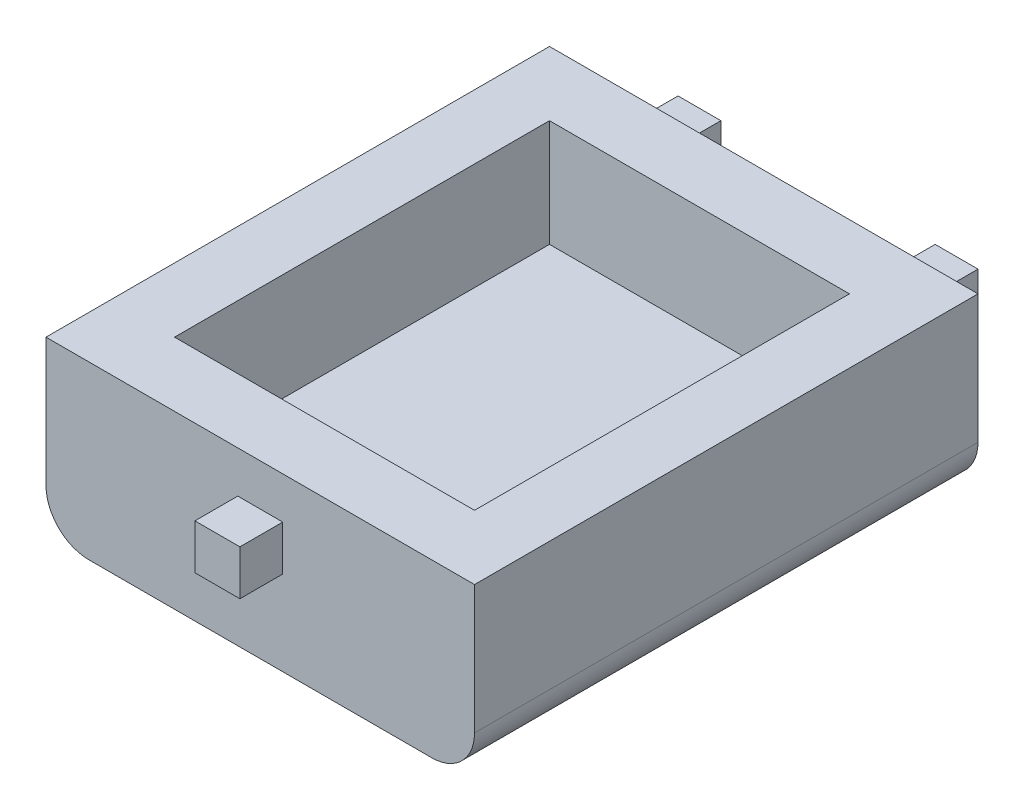
ISO-10303-21;
HEADER;
FILE_DESCRIPTION(('STEP AP214'),'2;1');
FILE_NAME('part.step','',(''),(''),'','','');
FILE_SCHEMA(('AUTOMOTIVE_DESIGN { 1 0 10303 214 1 1 1 1 }'));
ENDSEC;
DATA;
#1=APPLICATION_CONTEXT('core data for automotive mechanical design processes');
#2=APPLICATION_PROTOCOL_DEFINITION('international standard','automotive_design',2000,#1);
#3=PRODUCT_CONTEXT('',#1,'mechanical');
#4=PRODUCT('Part','Part','',(#3));
#5=PRODUCT_RELATED_PRODUCT_CATEGORY('part','',(#4));
#6=PRODUCT_DEFINITION_FORMATION('','',#4);
#7=PRODUCT_DEFINITION_CONTEXT('part definition',#1,'design');
#8=PRODUCT_DEFINITION('design','',#6,#7);
#9=PRODUCT_DEFINITION_SHAPE('','',#8);
#10=(LENGTH_UNIT() NAMED_UNIT(*) SI_UNIT(.MILLI.,.METRE.));
#11=(NAMED_UNIT(*) PLANE_ANGLE_UNIT() SI_UNIT($,.RADIAN.));
#12=(NAMED_UNIT(*) SI_UNIT($,.STERADIAN.) SOLID_ANGLE_UNIT());
#13=UNCERTAINTY_MEASURE_WITH_UNIT(LENGTH_MEASURE(1.E-05),#10,'distance_accuracy_value','');
#14=(GEOMETRIC_REPRESENTATION_CONTEXT(3) GLOBAL_UNCERTAINTY_ASSIGNED_CONTEXT((#13)) GLOBAL_UNIT_ASSIGNED_CONTEXT((#10,
#11,#12)) REPRESENTATION_CONTEXT('',''));
#15=CARTESIAN_POINT('',(0.,0.,0.));
#16=DIRECTION('',(0.,0.,1.));
#17=DIRECTION('',(1.,0.,0.));
#18=AXIS2_PLACEMENT_3D('',#15,#16,#17);
#19=CARTESIAN_POINT('',(-4.99999919028007,-0.999999999999999,-23.5));
#20=DIRECTION('',(0.,1.,0.));
#21=DIRECTION('',(-1.,0.,0.));
#22=AXIS2_PLACEMENT_3D('',#19,#20,#21);
#23=PLANE('',#22);
#24=DIRECTION('',(1.,0.,0.));
#25=VECTOR('',#24,1.);
#26=CARTESIAN_POINT('',(-6.99999919028007,-0.999999999999999,-26.5));
#27=LINE('',#26,#25);
#28=CARTESIAN_POINT('',(-6.99999919028007,-1.,-26.5));
#29=VERTEX_POINT('',#28);
#30=CARTESIAN_POINT('',(-4.99999919028007,-0.999999999999999,-26.5));
#31=VERTEX_POINT('',#30);
#32=EDGE_CURVE('E298',#29,#31,#27,.T.);
#33=ORIENTED_EDGE('',*,*,#32,.T.);
#34=DIRECTION('',(0.,0.,-1.));
#35=VECTOR('',#34,1.);
#36=CARTESIAN_POINT('',(-4.99999919028007,-0.999999999999999,-23.5));
#37=LINE('',#36,#35);
#38=CARTESIAN_POINT('',(-4.99999919028007,-0.999999999999999,-23.5));
#39=VERTEX_POINT('',#38);
#40=EDGE_CURVE('E316',#39,#31,#37,.T.);
#41=ORIENTED_EDGE('',*,*,#40,.F.);
#42=DIRECTION('',(1.,0.,0.));
#43=VECTOR('',#42,1.);
#44=CARTESIAN_POINT('',(-4.99999919028007,-0.999999999999999,-23.5));
#45=LINE('',#44,#43);
#46=CARTESIAN_POINT('',(-6.99999919028007,-1.,-23.5));
#47=VERTEX_POINT('',#46);
#48=EDGE_CURVE('E302',#47,#39,#45,.T.);
#49=ORIENTED_EDGE('',*,*,#48,.F.);
#50=DIRECTION('',(0.,0.,-1.));
#51=VECTOR('',#50,1.);
#52=CARTESIAN_POINT('',(-6.99999919028007,-1.,-23.5));
#53=LINE('',#52,#51);
#54=EDGE_CURVE('E315',#47,#29,#53,.T.);
#55=ORIENTED_EDGE('',*,*,#54,.T.);
#56=EDGE_LOOP('',(#33,#41,#49,#55));
#57=FACE_BOUND('',#56,.T.);
#58=ADVANCED_FACE('F45',(#57),#23,.F.);
#59=CARTESIAN_POINT('',(-4.99999919028007,-0.999999999999999,-23.5));
#60=DIRECTION('',(-1.,0.,0.));
#61=DIRECTION('',(0.,0.,1.));
#62=AXIS2_PLACEMENT_3D('',#59,#60,#61);
#63=PLANE('',#62);
#64=DIRECTION('',(0.,1.,0.));
#65=VECTOR('',#64,1.);
#66=CARTESIAN_POINT('',(-4.99999919028007,1.,-26.5));
#67=LINE('',#66,#65);
#68=CARTESIAN_POINT('',(-4.99999919028007,1.,-26.5));
#69=VERTEX_POINT('',#68);
#70=EDGE_CURVE('E294',#31,#69,#67,.T.);
#71=ORIENTED_EDGE('',*,*,#70,.T.);
#72=DIRECTION('',(0.,0.,-1.));
#73=VECTOR('',#72,1.);
#74=CARTESIAN_POINT('',(-4.99999919028007,1.,-23.5));
#75=LINE('',#74,#73);
#76=CARTESIAN_POINT('',(-4.99999919028007,1.,-23.5));
#77=VERTEX_POINT('',#76);
#78=EDGE_CURVE('E321',#77,#69,#75,.T.);
#79=ORIENTED_EDGE('',*,*,#78,.F.);
#80=DIRECTION('',(0.,1.,0.));
#81=VECTOR('',#80,1.);
#82=CARTESIAN_POINT('',(-4.99999919028007,-0.999999999999999,-23.5));
#83=LINE('',#82,#81);
#84=EDGE_CURVE('E312',#39,#77,#83,.T.);
#85=ORIENTED_EDGE('',*,*,#84,.F.);
#86=ORIENTED_EDGE('',*,*,#40,.T.);
#87=EDGE_LOOP('',(#71,#79,#85,#86));
#88=FACE_BOUND('',#87,.T.);
#89=ADVANCED_FACE('F467',(#88),#63,.F.);
#90=CARTESIAN_POINT('',(-4.99999919028007,1.,-23.5));
#91=DIRECTION('',(0.,-1.,0.));
#92=DIRECTION('',(1.,0.,0.));
#93=AXIS2_PLACEMENT_3D('',#90,#91,#92);
#94=PLANE('',#93);
#95=DIRECTION('',(-1.,0.,0.));
#96=VECTOR('',#95,1.);
#97=CARTESIAN_POINT('',(-6.99999919028007,1.,-26.5));
#98=LINE('',#97,#96);
#99=CARTESIAN_POINT('',(-6.99999919028007,1.,-26.5));
#100=VERTEX_POINT('',#99);
#101=EDGE_CURVE('E290',#69,#100,#98,.T.);
#102=ORIENTED_EDGE('',*,*,#101,.T.);
#103=DIRECTION('',(0.,0.,-1.));
#104=VECTOR('',#103,1.);
#105=CARTESIAN_POINT('',(-6.99999919028007,1.,-23.5));
#106=LINE('',#105,#104);
#107=CARTESIAN_POINT('',(-6.99999919028007,1.,-23.5));
#108=VERTEX_POINT('',#107);
#109=EDGE_CURVE('E325',#108,#100,#106,.T.);
#110=ORIENTED_EDGE('',*,*,#109,.F.);
#111=DIRECTION('',(-1.,0.,0.));
#112=VECTOR('',#111,1.);
#113=CARTESIAN_POINT('',(-4.99999919028007,1.,-23.5));
#114=LINE('',#113,#112);
#115=EDGE_CURVE('E308',#77,#108,#114,.T.);
#116=ORIENTED_EDGE('',*,*,#115,.F.);
#117=ORIENTED_EDGE('',*,*,#78,.T.);
#118=EDGE_LOOP('',(#102,#110,#116,#117));
#119=FACE_BOUND('',#118,.T.);
#120=ADVANCED_FACE('F474',(#119),#94,.F.);
#121=CARTESIAN_POINT('',(-6.99999919028007,-1.,-23.5));
#122=DIRECTION('',(1.,0.,0.));
#123=DIRECTION('',(0.,0.,-1.));
#124=AXIS2_PLACEMENT_3D('',#121,#122,#123);
#125=PLANE('',#124);
#126=DIRECTION('',(0.,-1.,0.));
#127=VECTOR('',#126,1.);
#128=CARTESIAN_POINT('',(-6.99999919028007,1.,-26.5));
#129=LINE('',#128,#127);
#130=EDGE_CURVE('E286',#100,#29,#129,.T.);
#131=ORIENTED_EDGE('',*,*,#130,.T.);
#132=ORIENTED_EDGE('',*,*,#54,.F.);
#133=DIRECTION('',(0.,-1.,0.));
#134=VECTOR('',#133,1.);
#135=CARTESIAN_POINT('',(-6.99999919028007,-1.,-23.5));
#136=LINE('',#135,#134);
#137=EDGE_CURVE('E305',#108,#47,#136,.T.);
#138=ORIENTED_EDGE('',*,*,#137,.F.);
#139=ORIENTED_EDGE('',*,*,#109,.T.);
#140=EDGE_LOOP('',(#131,#132,#138,#139));
#141=FACE_BOUND('',#140,.T.);
#142=ADVANCED_FACE('F479',(#141),#125,.F.);
#143=CARTESIAN_POINT('',(0.,0.,-26.5));
#144=DIRECTION('',(0.,0.,-1.));
#145=DIRECTION('',(1.,0.,0.));
#146=AXIS2_PLACEMENT_3D('',#143,#144,#145);
#147=PLANE('',#146);
#148=ORIENTED_EDGE('',*,*,#130,.F.);
#149=ORIENTED_EDGE('',*,*,#101,.F.);
#150=ORIENTED_EDGE('',*,*,#70,.F.);
#151=ORIENTED_EDGE('',*,*,#32,.F.);
#152=EDGE_LOOP('',(#148,#149,#150,#151));
#153=FACE_BOUND('',#152,.T.);
#154=ADVANCED_FACE('F585',(#153),#147,.T.);
#155=CARTESIAN_POINT('',(10.,-5.,-23.5));
#156=DIRECTION('',(-1.,0.,0.));
#157=DIRECTION('',(0.,0.,1.));
#158=AXIS2_PLACEMENT_3D('',#155,#156,#157);
#159=PLANE('',#158);
#160=DIRECTION('',(0.,1.,0.));
#161=VECTOR('',#160,1.);
#162=CARTESIAN_POINT('',(10.,-5.,0.));
#163=LINE('',#162,#161);
#164=CARTESIAN_POINT('',(10.,-3.,0.));
#165=VERTEX_POINT('',#164);
#166=CARTESIAN_POINT('',(10.,3.,0.));
#167=VERTEX_POINT('',#166);
#168=EDGE_CURVE('E283',#165,#167,#163,.T.);
#169=ORIENTED_EDGE('',*,*,#168,.F.);
#170=DIRECTION('',(0.,0.,1.));
#171=VECTOR('',#170,1.);
#172=CARTESIAN_POINT('',(10.,-3.,-23.5));
#173=LINE('',#172,#171);
#174=CARTESIAN_POINT('',(10.,-3.,-23.5));
#175=VERTEX_POINT('',#174);
#176=EDGE_CURVE('E69',#165,#175,#173,.F.);
#177=ORIENTED_EDGE('',*,*,#176,.T.);
#178=DIRECTION('',(0.,1.,0.));
#179=VECTOR('',#178,1.);
#180=CARTESIAN_POINT('',(10.,-5.,-23.5));
#181=LINE('',#180,#179);
#182=CARTESIAN_POINT('',(10.,3.,-23.5));
#183=VERTEX_POINT('',#182);
#184=EDGE_CURVE('E274',#175,#183,#181,.T.);
#185=ORIENTED_EDGE('',*,*,#184,.T.);
#186=DIRECTION('',(0.,0.,1.));
#187=VECTOR('',#186,1.);
#188=CARTESIAN_POINT('',(10.,3.,-23.5));
#189=LINE('',#188,#187);
#190=EDGE_CURVE('E246',#183,#167,#189,.T.);
#191=ORIENTED_EDGE('',*,*,#190,.T.);
#192=EDGE_LOOP('',(#169,#177,#185,#191));
#193=FACE_BOUND('',#192,.T.);
#194=ADVANCED_FACE('F452',(#193),#159,.F.);
#195=CARTESIAN_POINT('',(-10.,-5.,-23.5));
#196=DIRECTION('',(-1.,0.,0.));
#197=DIRECTION('',(0.,0.,1.));
#198=AXIS2_PLACEMENT_3D('',#195,#196,#197);
#199=PLANE('',#198);
#200=DIRECTION('',(0.,1.,0.));
#201=VECTOR('',#200,1.);
#202=CARTESIAN_POINT('',(-10.,-5.,-23.5));
#203=LINE('',#202,#201);
#204=CARTESIAN_POINT('',(-10.,-3.,-23.5));
#205=VERTEX_POINT('',#204);
#206=CARTESIAN_POINT('',(-10.,3.,-23.5));
#207=VERTEX_POINT('',#206);
#208=EDGE_CURVE('E277',#205,#207,#203,.T.);
#209=ORIENTED_EDGE('',*,*,#208,.F.);
#210=DIRECTION('',(0.,0.,1.));
#211=VECTOR('',#210,1.);
#212=CARTESIAN_POINT('',(-10.,-3.,-23.5));
#213=LINE('',#212,#211);
#214=CARTESIAN_POINT('',(-10.,-3.,0.));
#215=VERTEX_POINT('',#214);
#216=EDGE_CURVE('E11',#205,#215,#213,.T.);
#217=ORIENTED_EDGE('',*,*,#216,.T.);
#218=DIRECTION('',(0.,1.,0.));
#219=VECTOR('',#218,1.);
#220=CARTESIAN_POINT('',(-10.,-5.,0.));
#221=LINE('',#220,#219);
#222=CARTESIAN_POINT('',(-10.,3.,0.));
#223=VERTEX_POINT('',#222);
#224=EDGE_CURVE('E280',#215,#223,#221,.T.);
#225=ORIENTED_EDGE('',*,*,#224,.T.);
#226=DIRECTION('',(0.,0.,1.));
#227=VECTOR('',#226,1.);
#228=CARTESIAN_POINT('',(-10.,3.,-23.5));
#229=LINE('',#228,#227);
#230=EDGE_CURVE('E259',#207,#223,#229,.T.);
#231=ORIENTED_EDGE('',*,*,#230,.F.);
#232=EDGE_LOOP('',(#209,#217,#225,#231));
#233=FACE_BOUND('',#232,.T.);
#234=ADVANCED_FACE('F459',(#233),#199,.T.);
#235=CARTESIAN_POINT('',(0.,-5.,0.));
#236=DIRECTION('',(0.,-1.,0.));
#237=DIRECTION('',(0.,0.,-1.));
#238=AXIS2_PLACEMENT_3D('',#235,#236,#237);
#239=PLANE('',#238);
#240=DIRECTION('',(-1.,0.,0.));
#241=VECTOR('',#240,1.);
#242=CARTESIAN_POINT('',(10.,-5.,-23.5));
#243=LINE('',#242,#241);
#244=CARTESIAN_POINT('',(8.,-5.,-23.5));
#245=VERTEX_POINT('',#244);
#246=CARTESIAN_POINT('',(-8.,-5.,-23.5));
#247=VERTEX_POINT('',#246);
#248=EDGE_CURVE('E271',#245,#247,#243,.T.);
#249=ORIENTED_EDGE('',*,*,#248,.F.);
#250=DIRECTION('',(0.,0.,1.));
#251=VECTOR('',#250,1.);
#252=CARTESIAN_POINT('',(8.,-5.,0.));
#253=LINE('',#252,#251);
#254=CARTESIAN_POINT('',(8.,-5.,0.));
#255=VERTEX_POINT('',#254);
#256=EDGE_CURVE('E423',#245,#255,#253,.T.);
#257=ORIENTED_EDGE('',*,*,#256,.T.);
#258=DIRECTION('',(-1.,0.,0.));
#259=VECTOR('',#258,1.);
#260=CARTESIAN_POINT('',(10.,-5.,0.));
#261=LINE('',#260,#259);
#262=CARTESIAN_POINT('',(-8.,-5.,0.));
#263=VERTEX_POINT('',#262);
#264=EDGE_CURVE('E267',#255,#263,#261,.T.);
#265=ORIENTED_EDGE('',*,*,#264,.T.);
#266=DIRECTION('',(0.,0.,1.));
#267=VECTOR('',#266,1.);
#268=CARTESIAN_POINT('',(-8.,-5.,0.));
#269=LINE('',#268,#267);
#270=EDGE_CURVE('E420',#263,#247,#269,.F.);
#271=ORIENTED_EDGE('',*,*,#270,.T.);
#272=EDGE_LOOP('',(#249,#257,#265,#271));
#273=FACE_BOUND('',#272,.T.);
#274=ADVANCED_FACE('F445',(#273),#239,.T.);
#275=CARTESIAN_POINT('',(0.,3.,0.));
#276=DIRECTION('',(0.,-1.,0.));
#277=DIRECTION('',(0.,0.,-1.));
#278=AXIS2_PLACEMENT_3D('',#275,#276,#277);
#279=PLANE('',#278);
#280=DIRECTION('',(1.,0.,0.));
#281=VECTOR('',#280,1.);
#282=CARTESIAN_POINT('',(-7.,3.,-3.));
#283=LINE('',#282,#281);
#284=CARTESIAN_POINT('',(-7.,3.,-3.));
#285=VERTEX_POINT('',#284);
#286=CARTESIAN_POINT('',(7.,3.,-3.));
#287=VERTEX_POINT('',#286);
#288=EDGE_CURVE('E237',#285,#287,#283,.T.);
#289=ORIENTED_EDGE('',*,*,#288,.F.);
#290=DIRECTION('',(0.,0.,1.));
#291=VECTOR('',#290,1.);
#292=CARTESIAN_POINT('',(-7.,3.,-20.5));
#293=LINE('',#292,#291);
#294=CARTESIAN_POINT('',(-7.,3.,-20.5));
#295=VERTEX_POINT('',#294);
#296=EDGE_CURVE('E204',#295,#285,#293,.T.);
#297=ORIENTED_EDGE('',*,*,#296,.F.);
#298=DIRECTION('',(-1.,0.,0.));
#299=VECTOR('',#298,1.);
#300=CARTESIAN_POINT('',(-7.,3.,-20.5));
#301=LINE('',#300,#299);
#302=CARTESIAN_POINT('',(7.,3.,-20.5));
#303=VERTEX_POINT('',#302);
#304=EDGE_CURVE('E224',#303,#295,#301,.T.);
#305=ORIENTED_EDGE('',*,*,#304,.F.);
#306=DIRECTION('',(0.,0.,-1.));
#307=VECTOR('',#306,1.);
#308=CARTESIAN_POINT('',(7.,3.,-20.5));
#309=LINE('',#308,#307);
#310=EDGE_CURVE('E228',#287,#303,#309,.T.);
#311=ORIENTED_EDGE('',*,*,#310,.F.);
#312=EDGE_LOOP('',(#289,#297,#305,#311));
#313=FACE_BOUND('',#312,.T.);
#314=ORIENTED_EDGE('',*,*,#190,.F.);
#315=DIRECTION('',(-1.,0.,0.));
#316=VECTOR('',#315,1.);
#317=CARTESIAN_POINT('',(10.,3.,-23.5));
#318=LINE('',#317,#316);
#319=EDGE_CURVE('E263',#183,#207,#318,.T.);
#320=ORIENTED_EDGE('',*,*,#319,.T.);
#321=ORIENTED_EDGE('',*,*,#230,.T.);
#322=DIRECTION('',(-1.,0.,0.));
#323=VECTOR('',#322,1.);
#324=CARTESIAN_POINT('',(10.,3.,0.));
#325=LINE('',#324,#323);
#326=EDGE_CURVE('E255',#167,#223,#325,.T.);
#327=ORIENTED_EDGE('',*,*,#326,.F.);
#328=EDGE_LOOP('',(#314,#320,#321,#327));
#329=FACE_BOUND('',#328,.T.);
#330=ADVANCED_FACE('F455',(#313,#329),#279,.F.);
#331=CARTESIAN_POINT('',(0.,0.,-26.5));
#332=DIRECTION('',(0.,0.,-1.));
#333=DIRECTION('',(-1.,0.,0.));
#334=AXIS2_PLACEMENT_3D('',#331,#332,#333);
#335=PLANE('',#334);
#336=DIRECTION('',(0.,-1.,0.));
#337=VECTOR('',#336,1.);
#338=CARTESIAN_POINT('',(6.99999919028007,1.,-26.5));
#339=LINE('',#338,#337);
#340=CARTESIAN_POINT('',(6.99999919028007,1.,-26.5));
#341=VERTEX_POINT('',#340);
#342=CARTESIAN_POINT('',(6.99999919028007,-0.999999999999999,-26.5));
#343=VERTEX_POINT('',#342);
#344=EDGE_CURVE('E320',#341,#343,#339,.T.);
#345=ORIENTED_EDGE('',*,*,#344,.T.);
#346=DIRECTION('',(-1.,0.,0.));
#347=VECTOR('',#346,1.);
#348=CARTESIAN_POINT('',(6.99999919028007,-0.999999999999999,-26.5));
#349=LINE('',#348,#347);
#350=CARTESIAN_POINT('',(4.99999919028007,-0.999999999999999,-26.5));
#351=VERTEX_POINT('',#350);
#352=EDGE_CURVE('E334',#343,#351,#349,.T.);
#353=ORIENTED_EDGE('',*,*,#352,.T.);
#354=DIRECTION('',(0.,1.,0.));
#355=VECTOR('',#354,1.);
#356=CARTESIAN_POINT('',(4.99999919028007,1.,-26.5));
#357=LINE('',#356,#355);
#358=CARTESIAN_POINT('',(4.99999919028007,1.,-26.5));
#359=VERTEX_POINT('',#358);
#360=EDGE_CURVE('E337',#351,#359,#357,.T.);
#361=ORIENTED_EDGE('',*,*,#360,.T.);
#362=DIRECTION('',(1.,0.,0.));
#363=VECTOR('',#362,1.);
#364=CARTESIAN_POINT('',(6.99999919028007,1.,-26.5));
#365=LINE('',#364,#363);
#366=EDGE_CURVE('E340',#359,#341,#365,.T.);
#367=ORIENTED_EDGE('',*,*,#366,.T.);
#368=EDGE_LOOP('',(#345,#353,#361,#367));
#369=FACE_BOUND('',#368,.T.);
#370=ADVANCED_FACE('F481',(#369),#335,.T.);
#371=CARTESIAN_POINT('',(4.99999919028007,-0.999999999999999,-23.5));
#372=DIRECTION('',(0.,-1.,0.));
#373=DIRECTION('',(1.,0.,0.));
#374=AXIS2_PLACEMENT_3D('',#371,#372,#373);
#375=PLANE('',#374);
#376=DIRECTION('',(0.,0.,-1.));
#377=VECTOR('',#376,1.);
#378=CARTESIAN_POINT('',(4.99999919028007,-0.999999999999999,-23.5));
#379=LINE('',#378,#377);
#380=CARTESIAN_POINT('',(4.99999919028007,-0.999999999999999,-23.5));
#381=VERTEX_POINT('',#380);
#382=EDGE_CURVE('E359',#381,#351,#379,.T.);
#383=ORIENTED_EDGE('',*,*,#382,.T.);
#384=ORIENTED_EDGE('',*,*,#352,.F.);
#385=DIRECTION('',(0.,0.,-1.));
#386=VECTOR('',#385,1.);
#387=CARTESIAN_POINT('',(6.99999919028007,-1.,-23.5));
#388=LINE('',#387,#386);
#389=CARTESIAN_POINT('',(6.99999919028007,-1.,-23.5));
#390=VERTEX_POINT('',#389);
#391=EDGE_CURVE('E360',#390,#343,#388,.T.);
#392=ORIENTED_EDGE('',*,*,#391,.F.);
#393=DIRECTION('',(-1.,0.,0.));
#394=VECTOR('',#393,1.);
#395=CARTESIAN_POINT('',(4.99999919028007,-0.999999999999999,-23.5));
#396=LINE('',#395,#394);
#397=EDGE_CURVE('E343',#390,#381,#396,.T.);
#398=ORIENTED_EDGE('',*,*,#397,.T.);
#399=EDGE_LOOP('',(#383,#384,#392,#398));
#400=FACE_BOUND('',#399,.T.);
#401=ADVANCED_FACE('F483',(#400),#375,.T.);
#402=CARTESIAN_POINT('',(4.99999919028007,-0.999999999999999,-23.5));
#403=DIRECTION('',(-1.,0.,0.));
#404=DIRECTION('',(0.,0.,1.));
#405=AXIS2_PLACEMENT_3D('',#402,#403,#404);
#406=PLANE('',#405);
#407=DIRECTION('',(0.,0.,-1.));
#408=VECTOR('',#407,1.);
#409=CARTESIAN_POINT('',(4.99999919028007,1.,-23.5));
#410=LINE('',#409,#408);
#411=CARTESIAN_POINT('',(4.99999919028007,1.,-23.5));
#412=VERTEX_POINT('',#411);
#413=EDGE_CURVE('E369',#412,#359,#410,.T.);
#414=ORIENTED_EDGE('',*,*,#413,.T.);
#415=ORIENTED_EDGE('',*,*,#360,.F.);
#416=ORIENTED_EDGE('',*,*,#382,.F.);
#417=DIRECTION('',(0.,1.,0.));
#418=VECTOR('',#417,1.);
#419=CARTESIAN_POINT('',(4.99999919028007,-0.999999999999999,-23.5));
#420=LINE('',#419,#418);
#421=EDGE_CURVE('E347',#381,#412,#420,.T.);
#422=ORIENTED_EDGE('',*,*,#421,.T.);
#423=EDGE_LOOP('',(#414,#415,#416,#422));
#424=FACE_BOUND('',#423,.T.);
#425=ADVANCED_FACE('F492',(#424),#406,.T.);
#426=CARTESIAN_POINT('',(4.99999919028007,1.,-23.5));
#427=DIRECTION('',(0.,1.,0.));
#428=DIRECTION('',(-1.,0.,0.));
#429=AXIS2_PLACEMENT_3D('',#426,#427,#428);
#430=PLANE('',#429);
#431=DIRECTION('',(0.,0.,-1.));
#432=VECTOR('',#431,1.);
#433=CARTESIAN_POINT('',(6.99999919028007,1.,-23.5));
#434=LINE('',#433,#432);
#435=CARTESIAN_POINT('',(6.99999919028007,1.,-23.5));
#436=VERTEX_POINT('',#435);
#437=EDGE_CURVE('E365',#436,#341,#434,.T.);
#438=ORIENTED_EDGE('',*,*,#437,.T.);
#439=ORIENTED_EDGE('',*,*,#366,.F.);
#440=ORIENTED_EDGE('',*,*,#413,.F.);
#441=DIRECTION('',(1.,0.,0.));
#442=VECTOR('',#441,1.);
#443=CARTESIAN_POINT('',(4.99999919028007,1.,-23.5));
#444=LINE('',#443,#442);
#445=EDGE_CURVE('E351',#412,#436,#444,.T.);
#446=ORIENTED_EDGE('',*,*,#445,.T.);
#447=EDGE_LOOP('',(#438,#439,#440,#446));
#448=FACE_BOUND('',#447,.T.);
#449=ADVANCED_FACE('F488',(#448),#430,.T.);
#450=CARTESIAN_POINT('',(6.99999919028007,-1.,-23.5));
#451=DIRECTION('',(1.,0.,0.));
#452=DIRECTION('',(0.,0.,-1.));
#453=AXIS2_PLACEMENT_3D('',#450,#451,#452);
#454=PLANE('',#453);
#455=ORIENTED_EDGE('',*,*,#391,.T.);
#456=ORIENTED_EDGE('',*,*,#344,.F.);
#457=ORIENTED_EDGE('',*,*,#437,.F.);
#458=DIRECTION('',(0.,-1.,0.));
#459=VECTOR('',#458,1.);
#460=CARTESIAN_POINT('',(6.99999919028007,-1.,-23.5));
#461=LINE('',#460,#459);
#462=EDGE_CURVE('E355',#436,#390,#461,.T.);
#463=ORIENTED_EDGE('',*,*,#462,.T.);
#464=EDGE_LOOP('',(#455,#456,#457,#463));
#465=FACE_BOUND('',#464,.T.);
#466=ADVANCED_FACE('F485',(#465),#454,.T.);
#467=CARTESIAN_POINT('',(0.,0.,-23.5));
#468=DIRECTION('',(0.,0.,-1.));
#469=DIRECTION('',(-1.,0.,0.));
#470=AXIS2_PLACEMENT_3D('',#467,#468,#469);
#471=PLANE('',#470);
#472=ORIENTED_EDGE('',*,*,#462,.F.);
#473=ORIENTED_EDGE('',*,*,#445,.F.);
#474=ORIENTED_EDGE('',*,*,#421,.F.);
#475=ORIENTED_EDGE('',*,*,#397,.F.);
#476=EDGE_LOOP('',(#472,#473,#474,#475));
#477=FACE_BOUND('',#476,.T.);
#478=ORIENTED_EDGE('',*,*,#184,.F.);
#479=CARTESIAN_POINT('',(8.,-3.,-23.5));
#480=DIRECTION('',(0.,0.,-1.));
#481=DIRECTION('',(-1.,0.,0.));
#482=AXIS2_PLACEMENT_3D('',#479,#480,#481);
#483=CIRCLE('',#482,2.);
#484=EDGE_CURVE('E54',#175,#245,#483,.T.);
#485=ORIENTED_EDGE('',*,*,#484,.T.);
#486=ORIENTED_EDGE('',*,*,#248,.T.);
#487=CARTESIAN_POINT('',(-8.,-3.,-23.5));
#488=DIRECTION('',(0.,0.,-1.));
#489=DIRECTION('',(-1.,0.,0.));
#490=AXIS2_PLACEMENT_3D('',#487,#488,#489);
#491=CIRCLE('',#490,2.);
#492=EDGE_CURVE('E61',#247,#205,#491,.T.);
#493=ORIENTED_EDGE('',*,*,#492,.T.);
#494=ORIENTED_EDGE('',*,*,#208,.T.);
#495=ORIENTED_EDGE('',*,*,#319,.F.);
#496=EDGE_LOOP('',(#478,#485,#486,#493,#494,#495));
#497=FACE_BOUND('',#496,.T.);
#498=ORIENTED_EDGE('',*,*,#48,.T.);
#499=ORIENTED_EDGE('',*,*,#84,.T.);
#500=ORIENTED_EDGE('',*,*,#115,.T.);
#501=ORIENTED_EDGE('',*,*,#137,.T.);
#502=EDGE_LOOP('',(#498,#499,#500,#501));
#503=FACE_BOUND('',#502,.T.);
#504=ADVANCED_FACE('F439',(#477,#497,#503),#471,.T.);
#505=CARTESIAN_POINT('',(0.,0.,2.));
#506=DIRECTION('',(0.,0.,1.));
#507=DIRECTION('',(1.,0.,0.));
#508=AXIS2_PLACEMENT_3D('',#505,#506,#507);
#509=PLANE('',#508);
#510=DIRECTION('',(0.,1.,0.));
#511=VECTOR('',#510,1.);
#512=CARTESIAN_POINT('',(1.05,1.05,2.));
#513=LINE('',#512,#511);
#514=CARTESIAN_POINT('',(1.05,-1.05,2.));
#515=VERTEX_POINT('',#514);
#516=CARTESIAN_POINT('',(1.05,1.05,2.));
#517=VERTEX_POINT('',#516);
#518=EDGE_CURVE('E376',#515,#517,#513,.T.);
#519=ORIENTED_EDGE('',*,*,#518,.T.);
#520=DIRECTION('',(-1.,0.,0.));
#521=VECTOR('',#520,1.);
#522=CARTESIAN_POINT('',(-1.05,1.05,2.));
#523=LINE('',#522,#521);
#524=CARTESIAN_POINT('',(-1.05,1.05,2.));
#525=VERTEX_POINT('',#524);
#526=EDGE_CURVE('E380',#517,#525,#523,.T.);
#527=ORIENTED_EDGE('',*,*,#526,.T.);
#528=DIRECTION('',(0.,-1.,0.));
#529=VECTOR('',#528,1.);
#530=CARTESIAN_POINT('',(-1.05,1.05,2.));
#531=LINE('',#530,#529);
#532=CARTESIAN_POINT('',(-1.05,-1.05,2.));
#533=VERTEX_POINT('',#532);
#534=EDGE_CURVE('E384',#525,#533,#531,.T.);
#535=ORIENTED_EDGE('',*,*,#534,.T.);
#536=DIRECTION('',(1.,0.,0.));
#537=VECTOR('',#536,1.);
#538=CARTESIAN_POINT('',(-1.05,-1.05,2.));
#539=LINE('',#538,#537);
#540=EDGE_CURVE('E387',#533,#515,#539,.T.);
#541=ORIENTED_EDGE('',*,*,#540,.T.);
#542=EDGE_LOOP('',(#519,#527,#535,#541));
#543=FACE_BOUND('',#542,.T.);
#544=ADVANCED_FACE('F502',(#543),#509,.T.);
#545=CARTESIAN_POINT('',(-1.05,1.05,2.));
#546=DIRECTION('',(0.,-1.,0.));
#547=DIRECTION('',(0.,0.,-1.));
#548=AXIS2_PLACEMENT_3D('',#545,#546,#547);
#549=PLANE('',#548);
#550=DIRECTION('',(-1.,0.,0.));
#551=VECTOR('',#550,1.);
#552=CARTESIAN_POINT('',(-1.05,1.05,0.));
#553=LINE('',#552,#551);
#554=CARTESIAN_POINT('',(1.05,1.05,0.));
#555=VERTEX_POINT('',#554);
#556=CARTESIAN_POINT('',(-1.05,1.05,0.));
#557=VERTEX_POINT('',#556);
#558=EDGE_CURVE('E394',#555,#557,#553,.T.);
#559=ORIENTED_EDGE('',*,*,#558,.T.);
#560=DIRECTION('',(0.,0.,-1.));
#561=VECTOR('',#560,1.);
#562=CARTESIAN_POINT('',(-1.05,1.05,2.));
#563=LINE('',#562,#561);
#564=EDGE_CURVE('E412',#525,#557,#563,.T.);
#565=ORIENTED_EDGE('',*,*,#564,.F.);
#566=ORIENTED_EDGE('',*,*,#526,.F.);
#567=DIRECTION('',(0.,0.,-1.));
#568=VECTOR('',#567,1.);
#569=CARTESIAN_POINT('',(1.05,1.05,2.));
#570=LINE('',#569,#568);
#571=EDGE_CURVE('E416',#517,#555,#570,.T.);
#572=ORIENTED_EDGE('',*,*,#571,.T.);
#573=EDGE_LOOP('',(#559,#565,#566,#572));
#574=FACE_BOUND('',#573,.T.);
#575=ADVANCED_FACE('F510',(#574),#549,.F.);
#576=CARTESIAN_POINT('',(-1.05,1.05,2.));
#577=DIRECTION('',(1.,0.,0.));
#578=DIRECTION('',(0.,1.,0.));
#579=AXIS2_PLACEMENT_3D('',#576,#577,#578);
#580=PLANE('',#579);
#581=DIRECTION('',(0.,-1.,0.));
#582=VECTOR('',#581,1.);
#583=CARTESIAN_POINT('',(-1.05,1.05,0.));
#584=LINE('',#583,#582);
#585=CARTESIAN_POINT('',(-1.05,-1.05,0.));
#586=VERTEX_POINT('',#585);
#587=EDGE_CURVE('E398',#557,#586,#584,.T.);
#588=ORIENTED_EDGE('',*,*,#587,.T.);
#589=DIRECTION('',(0.,0.,-1.));
#590=VECTOR('',#589,1.);
#591=CARTESIAN_POINT('',(-1.05,-1.05,2.));
#592=LINE('',#591,#590);
#593=EDGE_CURVE('E408',#533,#586,#592,.T.);
#594=ORIENTED_EDGE('',*,*,#593,.F.);
#595=ORIENTED_EDGE('',*,*,#534,.F.);
#596=ORIENTED_EDGE('',*,*,#564,.T.);
#597=EDGE_LOOP('',(#588,#594,#595,#596));
#598=FACE_BOUND('',#597,.T.);
#599=ADVANCED_FACE('F515',(#598),#580,.F.);
#600=CARTESIAN_POINT('',(-1.05,-1.05,2.));
#601=DIRECTION('',(0.,1.,0.));
#602=DIRECTION('',(0.,0.,1.));
#603=AXIS2_PLACEMENT_3D('',#600,#601,#602);
#604=PLANE('',#603);
#605=DIRECTION('',(1.,0.,0.));
#606=VECTOR('',#605,1.);
#607=CARTESIAN_POINT('',(-1.05,-1.05,0.));
#608=LINE('',#607,#606);
#609=CARTESIAN_POINT('',(1.05,-1.05,0.));
#610=VERTEX_POINT('',#609);
#611=EDGE_CURVE('E381',#586,#610,#608,.T.);
#612=ORIENTED_EDGE('',*,*,#611,.T.);
#613=DIRECTION('',(0.,0.,-1.));
#614=VECTOR('',#613,1.);
#615=CARTESIAN_POINT('',(1.05,-1.05,2.));
#616=LINE('',#615,#614);
#617=EDGE_CURVE('E390',#515,#610,#616,.T.);
#618=ORIENTED_EDGE('',*,*,#617,.F.);
#619=ORIENTED_EDGE('',*,*,#540,.F.);
#620=ORIENTED_EDGE('',*,*,#593,.T.);
#621=EDGE_LOOP('',(#612,#618,#619,#620));
#622=FACE_BOUND('',#621,.T.);
#623=ADVANCED_FACE('F512',(#622),#604,.F.);
#624=CARTESIAN_POINT('',(1.05,1.05,2.));
#625=DIRECTION('',(-1.,0.,0.));
#626=DIRECTION('',(0.,-1.,0.));
#627=AXIS2_PLACEMENT_3D('',#624,#625,#626);
#628=PLANE('',#627);
#629=DIRECTION('',(0.,1.,0.));
#630=VECTOR('',#629,1.);
#631=CARTESIAN_POINT('',(1.05,1.05,0.));
#632=LINE('',#631,#630);
#633=EDGE_CURVE('E364',#610,#555,#632,.T.);
#634=ORIENTED_EDGE('',*,*,#633,.T.);
#635=ORIENTED_EDGE('',*,*,#571,.F.);
#636=ORIENTED_EDGE('',*,*,#518,.F.);
#637=ORIENTED_EDGE('',*,*,#617,.T.);
#638=EDGE_LOOP('',(#634,#635,#636,#637));
#639=FACE_BOUND('',#638,.T.);
#640=ADVANCED_FACE('F506',(#639),#628,.F.);
#641=CARTESIAN_POINT('',(0.,0.,0.));
#642=DIRECTION('',(0.,0.,1.));
#643=DIRECTION('',(1.,0.,0.));
#644=AXIS2_PLACEMENT_3D('',#641,#642,#643);
#645=PLANE('',#644);
#646=ORIENTED_EDGE('',*,*,#633,.F.);
#647=ORIENTED_EDGE('',*,*,#611,.F.);
#648=ORIENTED_EDGE('',*,*,#587,.F.);
#649=ORIENTED_EDGE('',*,*,#558,.F.);
#650=EDGE_LOOP('',(#646,#647,#648,#649));
#651=FACE_BOUND('',#650,.T.);
#652=ORIENTED_EDGE('',*,*,#264,.F.);
#653=CARTESIAN_POINT('',(8.,-3.,0.));
#654=DIRECTION('',(0.,0.,1.));
#655=DIRECTION('',(1.,0.,0.));
#656=AXIS2_PLACEMENT_3D('',#653,#654,#655);
#657=CIRCLE('',#656,2.);
#658=EDGE_CURVE('E430',#255,#165,#657,.T.);
#659=ORIENTED_EDGE('',*,*,#658,.T.);
#660=ORIENTED_EDGE('',*,*,#168,.T.);
#661=ORIENTED_EDGE('',*,*,#326,.T.);
#662=ORIENTED_EDGE('',*,*,#224,.F.);
#663=CARTESIAN_POINT('',(-8.,-3.,0.));
#664=DIRECTION('',(0.,0.,1.));
#665=DIRECTION('',(1.,0.,0.));
#666=AXIS2_PLACEMENT_3D('',#663,#664,#665);
#667=CIRCLE('',#666,2.);
#668=EDGE_CURVE('E427',#215,#263,#667,.T.);
#669=ORIENTED_EDGE('',*,*,#668,.T.);
#670=EDGE_LOOP('',(#652,#659,#660,#661,#662,#669));
#671=FACE_BOUND('',#670,.T.);
#672=ADVANCED_FACE('F450',(#651,#671),#645,.T.);
#673=CARTESIAN_POINT('',(-7.,-2.,-20.5));
#674=DIRECTION('',(-1.,0.,0.));
#675=DIRECTION('',(0.,0.,1.));
#676=AXIS2_PLACEMENT_3D('',#673,#674,#675);
#677=PLANE('',#676);
#678=ORIENTED_EDGE('',*,*,#296,.T.);
#679=DIRECTION('',(0.,1.,0.));
#680=VECTOR('',#679,1.);
#681=CARTESIAN_POINT('',(-7.,-2.,-3.));
#682=LINE('',#681,#680);
#683=CARTESIAN_POINT('',(-7.,-2.,-3.));
#684=VERTEX_POINT('',#683);
#685=EDGE_CURVE('E197',#684,#285,#682,.T.);
#686=ORIENTED_EDGE('',*,*,#685,.F.);
#687=DIRECTION('',(0.,0.,1.));
#688=VECTOR('',#687,1.);
#689=CARTESIAN_POINT('',(-7.,-2.,-20.5));
#690=LINE('',#689,#688);
#691=CARTESIAN_POINT('',(-7.,-2.,-20.5));
#692=VERTEX_POINT('',#691);
#693=EDGE_CURVE('E201',#692,#684,#690,.T.);
#694=ORIENTED_EDGE('',*,*,#693,.F.);
#695=DIRECTION('',(0.,1.,0.));
#696=VECTOR('',#695,1.);
#697=CARTESIAN_POINT('',(-7.,-2.,-20.5));
#698=LINE('',#697,#696);
#699=EDGE_CURVE('E243',#692,#295,#698,.T.);
#700=ORIENTED_EDGE('',*,*,#699,.T.);
#701=EDGE_LOOP('',(#678,#686,#694,#700));
#702=FACE_BOUND('',#701,.T.);
#703=ADVANCED_FACE('F199',(#702),#677,.F.);
#704=CARTESIAN_POINT('',(-7.,-2.,-20.5));
#705=DIRECTION('',(0.,0.,-1.));
#706=DIRECTION('',(-1.,0.,0.));
#707=AXIS2_PLACEMENT_3D('',#704,#705,#706);
#708=PLANE('',#707);
#709=ORIENTED_EDGE('',*,*,#304,.T.);
#710=ORIENTED_EDGE('',*,*,#699,.F.);
#711=DIRECTION('',(-1.,0.,0.));
#712=VECTOR('',#711,1.);
#713=CARTESIAN_POINT('',(-7.,-2.,-20.5));
#714=LINE('',#713,#712);
#715=CARTESIAN_POINT('',(7.,-2.,-20.5));
#716=VERTEX_POINT('',#715);
#717=EDGE_CURVE('E210',#716,#692,#714,.T.);
#718=ORIENTED_EDGE('',*,*,#717,.F.);
#719=DIRECTION('',(0.,1.,0.));
#720=VECTOR('',#719,1.);
#721=CARTESIAN_POINT('',(7.,-2.,-20.5));
#722=LINE('',#721,#720);
#723=EDGE_CURVE('E247',#716,#303,#722,.T.);
#724=ORIENTED_EDGE('',*,*,#723,.T.);
#725=EDGE_LOOP('',(#709,#710,#718,#724));
#726=FACE_BOUND('',#725,.T.);
#727=ADVANCED_FACE('F662',(#726),#708,.F.);
#728=CARTESIAN_POINT('',(7.,-2.,-20.5));
#729=DIRECTION('',(1.,0.,0.));
#730=DIRECTION('',(0.,0.,-1.));
#731=AXIS2_PLACEMENT_3D('',#728,#729,#730);
#732=PLANE('',#731);
#733=ORIENTED_EDGE('',*,*,#310,.T.);
#734=ORIENTED_EDGE('',*,*,#723,.F.);
#735=DIRECTION('',(0.,0.,-1.));
#736=VECTOR('',#735,1.);
#737=CARTESIAN_POINT('',(7.,-2.,-20.5));
#738=LINE('',#737,#736);
#739=CARTESIAN_POINT('',(7.,-2.,-3.));
#740=VERTEX_POINT('',#739);
#741=EDGE_CURVE('E219',#740,#716,#738,.T.);
#742=ORIENTED_EDGE('',*,*,#741,.F.);
#743=DIRECTION('',(0.,1.,0.));
#744=VECTOR('',#743,1.);
#745=CARTESIAN_POINT('',(7.,-2.,-3.));
#746=LINE('',#745,#744);
#747=EDGE_CURVE('E209',#740,#287,#746,.T.);
#748=ORIENTED_EDGE('',*,*,#747,.T.);
#749=EDGE_LOOP('',(#733,#734,#742,#748));
#750=FACE_BOUND('',#749,.T.);
#751=ADVANCED_FACE('F669',(#750),#732,.F.);
#752=CARTESIAN_POINT('',(-7.,-2.,-3.));
#753=DIRECTION('',(0.,0.,1.));
#754=DIRECTION('',(1.,0.,0.));
#755=AXIS2_PLACEMENT_3D('',#752,#753,#754);
#756=PLANE('',#755);
#757=ORIENTED_EDGE('',*,*,#288,.T.);
#758=ORIENTED_EDGE('',*,*,#747,.F.);
#759=DIRECTION('',(1.,0.,0.));
#760=VECTOR('',#759,1.);
#761=CARTESIAN_POINT('',(-7.,-2.,-3.));
#762=LINE('',#761,#760);
#763=EDGE_CURVE('E213',#684,#740,#762,.T.);
#764=ORIENTED_EDGE('',*,*,#763,.F.);
#765=ORIENTED_EDGE('',*,*,#685,.T.);
#766=EDGE_LOOP('',(#757,#758,#764,#765));
#767=FACE_BOUND('',#766,.T.);
#768=ADVANCED_FACE('F214',(#767),#756,.F.);
#769=CARTESIAN_POINT('',(0.,-2.,0.));
#770=DIRECTION('',(0.,1.,0.));
#771=DIRECTION('',(0.,0.,1.));
#772=AXIS2_PLACEMENT_3D('',#769,#770,#771);
#773=PLANE('',#772);
#774=ORIENTED_EDGE('',*,*,#693,.T.);
#775=ORIENTED_EDGE('',*,*,#763,.T.);
#776=ORIENTED_EDGE('',*,*,#741,.T.);
#777=ORIENTED_EDGE('',*,*,#717,.T.);
#778=EDGE_LOOP('',(#774,#775,#776,#777));
#779=FACE_BOUND('',#778,.T.);
#780=ADVANCED_FACE('F221',(#779),#773,.T.);
#781=CARTESIAN_POINT('',(8.,-3.,0.));
#782=DIRECTION('',(0.,0.,-1.));
#783=DIRECTION('',(-1.,0.,0.));
#784=AXIS2_PLACEMENT_3D('',#781,#782,#783);
#785=CYLINDRICAL_SURFACE('',#784,2.);
#786=ORIENTED_EDGE('',*,*,#484,.F.);
#787=ORIENTED_EDGE('',*,*,#176,.F.);
#788=ORIENTED_EDGE('',*,*,#658,.F.);
#789=ORIENTED_EDGE('',*,*,#256,.F.);
#790=EDGE_LOOP('',(#786,#787,#788,#789));
#791=FACE_BOUND('',#790,.T.);
#792=ADVANCED_FACE('F448',(#791),#785,.T.);
#793=CARTESIAN_POINT('',(-8.,-3.,-23.5));
#794=DIRECTION('',(0.,0.,1.));
#795=DIRECTION('',(1.,0.,0.));
#796=AXIS2_PLACEMENT_3D('',#793,#794,#795);
#797=CYLINDRICAL_SURFACE('',#796,2.);
#798=ORIENTED_EDGE('',*,*,#492,.F.);
#799=ORIENTED_EDGE('',*,*,#270,.F.);
#800=ORIENTED_EDGE('',*,*,#668,.F.);
#801=ORIENTED_EDGE('',*,*,#216,.F.);
#802=EDGE_LOOP('',(#798,#799,#800,#801));
#803=FACE_BOUND('',#802,.T.);
#804=ADVANCED_FACE('F47',(#803),#797,.T.);
#805=CLOSED_SHELL('',(#58,#89,#120,#142,#154,#194,#234,#274,#330,#370,#401,#425,#449,#466,#504,
#544,#575,#599,#623,#640,#672,#703,#727,#751,#768,#780,#792,#804));
#806=MANIFOLD_SOLID_BREP('B2',#805);
#807=ADVANCED_BREP_SHAPE_REPRESENTATION('',(#18,#806),#14);
#808=SHAPE_DEFINITION_REPRESENTATION(#9,#807);
ENDSEC;
END-ISO-10303-21;
